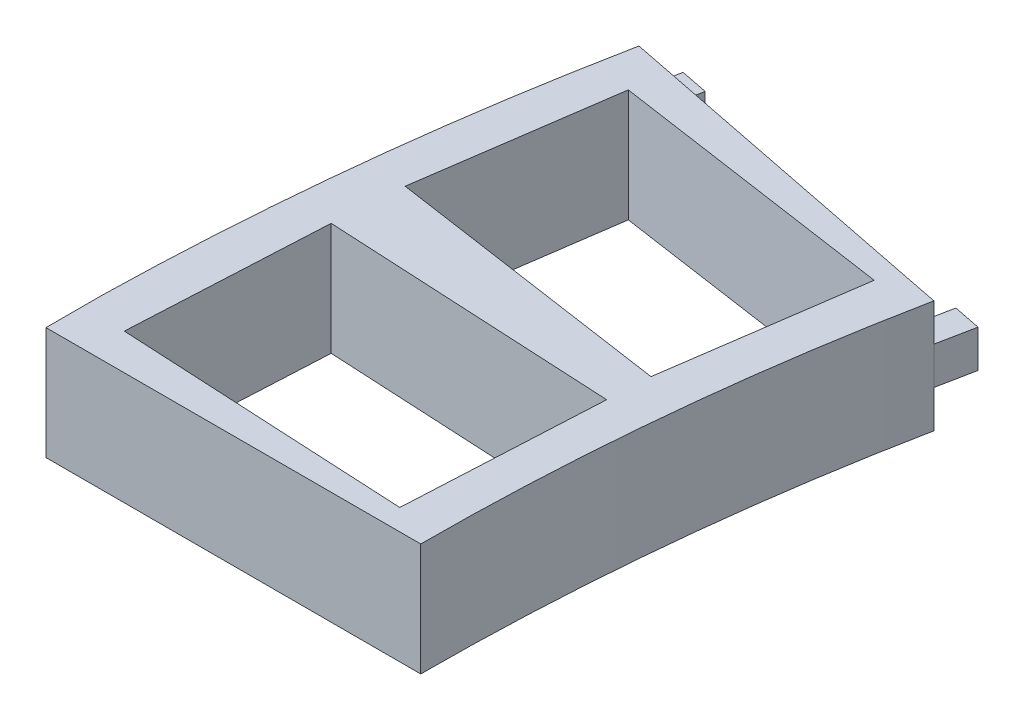
ISO-10303-21;
HEADER;
FILE_DESCRIPTION(('STEP AP214'),'2;1');
FILE_NAME('part.step','',(''),(''),'','','');
FILE_SCHEMA(('AUTOMOTIVE_DESIGN { 1 0 10303 214 1 1 1 1 }'));
ENDSEC;
DATA;
#1=APPLICATION_CONTEXT('core data for automotive mechanical design processes');
#2=APPLICATION_PROTOCOL_DEFINITION('international standard','automotive_design',2000,#1);
#3=PRODUCT_CONTEXT('',#1,'mechanical');
#4=PRODUCT('Part','Part','',(#3));
#5=PRODUCT_RELATED_PRODUCT_CATEGORY('part','',(#4));
#6=PRODUCT_DEFINITION_FORMATION('','',#4);
#7=PRODUCT_DEFINITION_CONTEXT('part definition',#1,'design');
#8=PRODUCT_DEFINITION('design','',#6,#7);
#9=PRODUCT_DEFINITION_SHAPE('','',#8);
#10=(LENGTH_UNIT() NAMED_UNIT(*) SI_UNIT(.MILLI.,.METRE.));
#11=(NAMED_UNIT(*) PLANE_ANGLE_UNIT() SI_UNIT($,.RADIAN.));
#12=(NAMED_UNIT(*) SI_UNIT($,.STERADIAN.) SOLID_ANGLE_UNIT());
#13=UNCERTAINTY_MEASURE_WITH_UNIT(LENGTH_MEASURE(1.E-05),#10,'distance_accuracy_value','');
#14=(GEOMETRIC_REPRESENTATION_CONTEXT(3) GLOBAL_UNCERTAINTY_ASSIGNED_CONTEXT((#13)) GLOBAL_UNIT_ASSIGNED_CONTEXT((#10,
#11,#12)) REPRESENTATION_CONTEXT('',''));
#15=CARTESIAN_POINT('',(0.,0.,0.));
#16=DIRECTION('',(0.,0.,1.));
#17=DIRECTION('',(1.,0.,0.));
#18=AXIS2_PLACEMENT_3D('',#15,#16,#17);
#19=CARTESIAN_POINT('',(0.,12.,0.));
#20=DIRECTION('',(0.,-1.,0.));
#21=DIRECTION('',(0.,0.,-1.));
#22=AXIS2_PLACEMENT_3D('',#19,#20,#21);
#23=CYLINDRICAL_SURFACE('',#22,295.189854561563);
#24=DIRECTION('',(0.,-1.,0.));
#25=VECTOR('',#24,1.);
#26=CARTESIAN_POINT('',(-289.653551964812,12.,-56.9022852813899));
#27=LINE('',#26,#25);
#28=CARTESIAN_POINT('',(-289.653551964812,0.,-56.9022852813899));
#29=VERTEX_POINT('',#28);
#30=CARTESIAN_POINT('',(-289.653551964812,12.,-56.9022852813899));
#31=VERTEX_POINT('',#30);
#32=EDGE_CURVE('E11',#29,#31,#27,.F.);
#33=ORIENTED_EDGE('',*,*,#32,.F.);
#34=CARTESIAN_POINT('',(0.,0.,0.));
#35=DIRECTION('',(0.,1.,0.));
#36=DIRECTION('',(0.,0.,-1.));
#37=AXIS2_PLACEMENT_3D('',#34,#35,#36);
#38=CIRCLE('',#37,295.189854561563);
#39=CARTESIAN_POINT('',(-295.127762341236,0.,-6.0542655650463));
#40=VERTEX_POINT('',#39);
#41=EDGE_CURVE('E339',#29,#40,#38,.T.);
#42=ORIENTED_EDGE('',*,*,#41,.T.);
#43=DIRECTION('',(0.,-1.,0.));
#44=VECTOR('',#43,1.);
#45=CARTESIAN_POINT('',(-295.127762341236,12.,-6.0542655650463));
#46=LINE('',#45,#44);
#47=CARTESIAN_POINT('',(-295.127762341236,12.,-6.0542655650463));
#48=VERTEX_POINT('',#47);
#49=EDGE_CURVE('E375',#48,#40,#46,.T.);
#50=ORIENTED_EDGE('',*,*,#49,.F.);
#51=CARTESIAN_POINT('',(0.,12.,0.));
#52=DIRECTION('',(0.,1.,0.));
#53=DIRECTION('',(0.,0.,-1.));
#54=AXIS2_PLACEMENT_3D('',#51,#52,#53);
#55=CIRCLE('',#54,295.189854561563);
#56=EDGE_CURVE('E51',#31,#48,#55,.T.);
#57=ORIENTED_EDGE('',*,*,#56,.F.);
#58=EDGE_LOOP('',(#33,#42,#50,#57));
#59=FACE_BOUND('',#58,.T.);
#60=ADVANCED_FACE('F37',(#59),#23,.T.);
#61=DIRECTION('',(0.,-1.,0.));
#62=VECTOR('',#61,1.);
#63=CARTESIAN_POINT('',(-289.54025753095,12.,-57.475990682963));
#64=LINE('',#63,#62);
#65=CARTESIAN_POINT('',(-289.54025753095,12.,-57.4759906829631));
#66=VERTEX_POINT('',#65);
#67=CARTESIAN_POINT('',(-289.54025753095,0.,-57.475990682963));
#68=VERTEX_POINT('',#67);
#69=EDGE_CURVE('E58',#66,#68,#64,.T.);
#70=ORIENTED_EDGE('',*,*,#69,.F.);
#71=CARTESIAN_POINT('',(-289.517864278352,12.,-57.5886837823096));
#72=VERTEX_POINT('',#71);
#73=EDGE_CURVE('E340',#72,#66,#55,.T.);
#74=ORIENTED_EDGE('',*,*,#73,.F.);
#75=DIRECTION('',(0.,-1.,0.));
#76=VECTOR('',#75,1.);
#77=CARTESIAN_POINT('',(-289.517864278352,12.,-57.5886837823096));
#78=LINE('',#77,#76);
#79=CARTESIAN_POINT('',(-289.517864278352,0.,-57.5886837823096));
#80=VERTEX_POINT('',#79);
#81=EDGE_CURVE('E350',#72,#80,#78,.T.);
#82=ORIENTED_EDGE('',*,*,#81,.T.);
#83=EDGE_CURVE('E351',#80,#68,#38,.T.);
#84=ORIENTED_EDGE('',*,*,#83,.T.);
#85=EDGE_LOOP('',(#70,#74,#82,#84));
#86=FACE_BOUND('',#85,.T.);
#87=ADVANCED_FACE('F403',(#86),#23,.T.);
#88=CARTESIAN_POINT('',(0.,12.,0.));
#89=DIRECTION('',(0.,-1.,0.));
#90=DIRECTION('',(0.,0.,-1.));
#91=AXIS2_PLACEMENT_3D('',#88,#89,#90);
#92=PLANE('',#91);
#93=DIRECTION('',(-0.98078528040323,0.,-0.195090322016129));
#94=VECTOR('',#93,1.);
#95=CARTESIAN_POINT('',(-289.517864278352,12.,-57.5886837823096));
#96=LINE('',#95,#94);
#97=CARTESIAN_POINT('',(-250.286431131361,12.,-49.785066539345));
#98=VERTEX_POINT('',#97);
#99=EDGE_CURVE('E348',#98,#72,#96,.T.);
#100=ORIENTED_EDGE('',*,*,#99,.T.);
#101=ORIENTED_EDGE('',*,*,#73,.T.);
#102=DIRECTION('',(-0.195090322016147,0.,0.980785280403227));
#103=VECTOR('',#102,1.);
#104=CARTESIAN_POINT('',(-289.654343319705,12.,-56.902442691665));
#105=LINE('',#104,#103);
#106=CARTESIAN_POINT('',(-289.654343319705,12.,-56.902442691665));
#107=VERTEX_POINT('',#106);
#108=EDGE_CURVE('E233',#66,#107,#105,.T.);
#109=ORIENTED_EDGE('',*,*,#108,.T.);
#110=DIRECTION('',(-0.98078528040323,0.,-0.195090322016129));
#111=VECTOR('',#110,1.);
#112=CARTESIAN_POINT('',(-286.711987478495,12.,-56.3171717256166));
#113=LINE('',#112,#111);
#114=EDGE_CURVE('E229',#31,#107,#113,.T.);
#115=ORIENTED_EDGE('',*,*,#114,.F.);
#116=ORIENTED_EDGE('',*,*,#56,.T.);
#117=DIRECTION('',(0.,0.,1.));
#118=VECTOR('',#117,1.);
#119=CARTESIAN_POINT('',(-295.127762341236,12.,-6.0542655650463));
#120=LINE('',#119,#118);
#121=CARTESIAN_POINT('',(-295.127762341235,12.,-3.79080447587832E-12));
#122=VERTEX_POINT('',#121);
#123=EDGE_CURVE('E342',#48,#122,#120,.T.);
#124=ORIENTED_EDGE('',*,*,#123,.T.);
#125=DIRECTION('',(1.,0.,0.));
#126=VECTOR('',#125,1.);
#127=CARTESIAN_POINT('',(-295.127762341235,12.,-3.79080447587832E-12));
#128=LINE('',#127,#126);
#129=CARTESIAN_POINT('',(-255.189832201051,12.,0.));
#130=VERTEX_POINT('',#129);
#131=EDGE_CURVE('E344',#122,#130,#128,.T.);
#132=ORIENTED_EDGE('',*,*,#131,.T.);
#133=CARTESIAN_POINT('',(0.,12.,0.));
#134=DIRECTION('',(0.,-1.,0.));
#135=DIRECTION('',(0.,0.,1.));
#136=AXIS2_PLACEMENT_3D('',#133,#134,#135);
#137=CIRCLE('',#136,255.189832201051);
#138=EDGE_CURVE('E346',#130,#98,#137,.T.);
#139=ORIENTED_EDGE('',*,*,#138,.T.);
#140=EDGE_LOOP('',(#100,#101,#109,#115,#116,#124,#132,#139));
#141=FACE_BOUND('',#140,.T.);
#142=DIRECTION('',(0.998667165886908,0.,0.0516129032259473));
#143=VECTOR('',#142,1.);
#144=CARTESIAN_POINT('',(-259.674858728616,12.,-2.25));
#145=LINE('',#144,#143);
#146=CARTESIAN_POINT('',(-290.633540871111,12.,-3.85000000000439));
#147=VERTEX_POINT('',#146);
#148=CARTESIAN_POINT('',(-259.674858728616,12.,-2.25));
#149=VERTEX_POINT('',#148);
#150=EDGE_CURVE('E278',#147,#149,#145,.T.);
#151=ORIENTED_EDGE('',*,*,#150,.F.);
#152=DIRECTION('',(-0.0513637982567964,0.,0.9986800089261));
#153=VECTOR('',#152,1.);
#154=CARTESIAN_POINT('',(-290.633540871111,12.,-3.85000000000439));
#155=LINE('',#154,#153);
#156=CARTESIAN_POINT('',(-289.554901107718,12.,-24.8222801874558));
#157=VERTEX_POINT('',#156);
#158=EDGE_CURVE('E286',#157,#147,#155,.T.);
#159=ORIENTED_EDGE('',*,*,#158,.F.);
#160=DIRECTION('',(-0.998667165886902,0.,-0.0516129032260692));
#161=VECTOR('',#160,1.);
#162=CARTESIAN_POINT('',(-289.554901107718,12.,-24.8222801874558));
#163=LINE('',#162,#161);
#164=CARTESIAN_POINT('',(-258.596218965224,12.,-23.2222801874477));
#165=VERTEX_POINT('',#164);
#166=EDGE_CURVE('E283',#165,#157,#163,.T.);
#167=ORIENTED_EDGE('',*,*,#166,.F.);
#168=DIRECTION('',(0.0513637982567872,0.,-0.9986800089261));
#169=VECTOR('',#168,1.);
#170=CARTESIAN_POINT('',(-258.596218965224,12.,-23.2222801874477));
#171=LINE('',#170,#169);
#172=EDGE_CURVE('E280',#149,#165,#171,.T.);
#173=ORIENTED_EDGE('',*,*,#172,.F.);
#174=EDGE_LOOP('',(#151,#159,#167,#173));
#175=FACE_BOUND('',#174,.T.);
#176=DIRECTION('',(0.989547234234407,0.,0.144209123217066));
#177=VECTOR('',#176,1.);
#178=CARTESIAN_POINT('',(-258.362561507797,12.,-27.7162098923483));
#179=LINE('',#178,#177);
#180=CARTESIAN_POINT('',(-289.038525769063,12.,-32.1866927120774));
#181=VERTEX_POINT('',#180);
#182=CARTESIAN_POINT('',(-258.362561507797,12.,-27.7162098923483));
#183=VERTEX_POINT('',#182);
#184=EDGE_CURVE('E309',#181,#183,#179,.T.);
#185=ORIENTED_EDGE('',*,*,#184,.F.);
#186=DIRECTION('',(-0.142745540145655,0.,0.989759420651567));
#187=VECTOR('',#186,1.);
#188=CARTESIAN_POINT('',(-289.038525769063,12.,-32.1866927120774));
#189=LINE('',#188,#187);
#190=CARTESIAN_POINT('',(-286.040869426004,12.,-52.9716405457603));
#191=VERTEX_POINT('',#190);
#192=EDGE_CURVE('E317',#191,#181,#189,.T.);
#193=ORIENTED_EDGE('',*,*,#192,.F.);
#194=DIRECTION('',(-0.989547234234407,0.,-0.144209123217066));
#195=VECTOR('',#194,1.);
#196=CARTESIAN_POINT('',(-286.040869426004,12.,-52.9716405457603));
#197=LINE('',#196,#195);
#198=CARTESIAN_POINT('',(-255.364905164738,12.,-48.5011577260312));
#199=VERTEX_POINT('',#198);
#200=EDGE_CURVE('E314',#199,#191,#197,.T.);
#201=ORIENTED_EDGE('',*,*,#200,.F.);
#202=DIRECTION('',(0.142745540145655,0.,-0.989759420651567));
#203=VECTOR('',#202,1.);
#204=CARTESIAN_POINT('',(-255.364905164738,12.,-48.5011577260312));
#205=LINE('',#204,#203);
#206=EDGE_CURVE('E311',#183,#199,#205,.T.);
#207=ORIENTED_EDGE('',*,*,#206,.F.);
#208=EDGE_LOOP('',(#185,#193,#201,#207));
#209=FACE_BOUND('',#208,.T.);
#210=ADVANCED_FACE('F407',(#141,#175,#209),#92,.F.);
#211=CARTESIAN_POINT('',(0.,0.,0.));
#212=DIRECTION('',(0.,-1.,0.));
#213=DIRECTION('',(0.,0.,-1.));
#214=AXIS2_PLACEMENT_3D('',#211,#212,#213);
#215=PLANE('',#214);
#216=ORIENTED_EDGE('',*,*,#41,.F.);
#217=DIRECTION('',(-0.98078528040323,0.,-0.195090322016129));
#218=VECTOR('',#217,1.);
#219=CARTESIAN_POINT('',(-286.711987478495,0.,-56.3171717256166));
#220=LINE('',#219,#218);
#221=CARTESIAN_POINT('',(-289.654343319705,0.,-56.902442691665));
#222=VERTEX_POINT('',#221);
#223=EDGE_CURVE('E240',#29,#222,#220,.T.);
#224=ORIENTED_EDGE('',*,*,#223,.T.);
#225=DIRECTION('',(0.195090322016135,0.,-0.980785280403229));
#226=VECTOR('',#225,1.);
#227=CARTESIAN_POINT('',(-289.517842347491,0.,-57.5886794199901));
#228=LINE('',#227,#226);
#229=EDGE_CURVE('E222',#222,#68,#228,.T.);
#230=ORIENTED_EDGE('',*,*,#229,.T.);
#231=ORIENTED_EDGE('',*,*,#83,.F.);
#232=DIRECTION('',(-0.98078528040323,0.,-0.195090322016129));
#233=VECTOR('',#232,1.);
#234=CARTESIAN_POINT('',(-289.517864278352,0.,-57.5886837823096));
#235=LINE('',#234,#233);
#236=CARTESIAN_POINT('',(-250.286431131361,0.,-49.785066539345));
#237=VERTEX_POINT('',#236);
#238=EDGE_CURVE('E360',#237,#80,#235,.T.);
#239=ORIENTED_EDGE('',*,*,#238,.F.);
#240=CARTESIAN_POINT('',(0.,0.,0.));
#241=DIRECTION('',(0.,-1.,0.));
#242=DIRECTION('',(0.,0.,1.));
#243=AXIS2_PLACEMENT_3D('',#240,#241,#242);
#244=CIRCLE('',#243,255.189832201051);
#245=CARTESIAN_POINT('',(-255.189832201051,0.,0.));
#246=VERTEX_POINT('',#245);
#247=EDGE_CURVE('E357',#246,#237,#244,.T.);
#248=ORIENTED_EDGE('',*,*,#247,.F.);
#249=DIRECTION('',(1.,0.,0.));
#250=VECTOR('',#249,1.);
#251=CARTESIAN_POINT('',(-295.127762341235,0.,-3.79080447587832E-12));
#252=LINE('',#251,#250);
#253=CARTESIAN_POINT('',(-295.127762341235,0.,-3.79080447587832E-12));
#254=VERTEX_POINT('',#253);
#255=EDGE_CURVE('E355',#254,#246,#252,.T.);
#256=ORIENTED_EDGE('',*,*,#255,.F.);
#257=DIRECTION('',(0.,0.,1.));
#258=VECTOR('',#257,1.);
#259=CARTESIAN_POINT('',(-295.127762341236,0.,-6.0542655650463));
#260=LINE('',#259,#258);
#261=EDGE_CURVE('E353',#40,#254,#260,.T.);
#262=ORIENTED_EDGE('',*,*,#261,.F.);
#263=EDGE_LOOP('',(#216,#224,#230,#231,#239,#248,#256,#262));
#264=FACE_BOUND('',#263,.T.);
#265=DIRECTION('',(-0.142745540145655,0.,0.989759420651567));
#266=VECTOR('',#265,1.);
#267=CARTESIAN_POINT('',(-289.038525769063,0.,-32.1866927120774));
#268=LINE('',#267,#266);
#269=CARTESIAN_POINT('',(-286.040869426004,0.,-52.9716405457603));
#270=VERTEX_POINT('',#269);
#271=CARTESIAN_POINT('',(-289.038525769063,0.,-32.1866927120774));
#272=VERTEX_POINT('',#271);
#273=EDGE_CURVE('E312',#270,#272,#268,.T.);
#274=ORIENTED_EDGE('',*,*,#273,.T.);
#275=DIRECTION('',(0.989547234234407,0.,0.144209123217066));
#276=VECTOR('',#275,1.);
#277=CARTESIAN_POINT('',(-258.362561507797,0.,-27.7162098923483));
#278=LINE('',#277,#276);
#279=CARTESIAN_POINT('',(-258.362561507797,0.,-27.7162098923483));
#280=VERTEX_POINT('',#279);
#281=EDGE_CURVE('E308',#272,#280,#278,.T.);
#282=ORIENTED_EDGE('',*,*,#281,.T.);
#283=DIRECTION('',(0.142745540145655,0.,-0.989759420651567));
#284=VECTOR('',#283,1.);
#285=CARTESIAN_POINT('',(-255.364905164738,0.,-48.5011577260312));
#286=LINE('',#285,#284);
#287=CARTESIAN_POINT('',(-255.364905164738,0.,-48.5011577260312));
#288=VERTEX_POINT('',#287);
#289=EDGE_CURVE('E322',#280,#288,#286,.T.);
#290=ORIENTED_EDGE('',*,*,#289,.T.);
#291=DIRECTION('',(-0.989547234234407,0.,-0.144209123217066));
#292=VECTOR('',#291,1.);
#293=CARTESIAN_POINT('',(-286.040869426004,0.,-52.9716405457603));
#294=LINE('',#293,#292);
#295=EDGE_CURVE('E325',#288,#270,#294,.T.);
#296=ORIENTED_EDGE('',*,*,#295,.T.);
#297=EDGE_LOOP('',(#274,#282,#290,#296));
#298=FACE_BOUND('',#297,.T.);
#299=DIRECTION('',(-0.0513637982567964,0.,0.9986800089261));
#300=VECTOR('',#299,1.);
#301=CARTESIAN_POINT('',(-290.633540871111,0.,-3.85000000000439));
#302=LINE('',#301,#300);
#303=CARTESIAN_POINT('',(-289.554901107718,0.,-24.8222801874558));
#304=VERTEX_POINT('',#303);
#305=CARTESIAN_POINT('',(-290.633540871111,0.,-3.8500000000044));
#306=VERTEX_POINT('',#305);
#307=EDGE_CURVE('E281',#304,#306,#302,.T.);
#308=ORIENTED_EDGE('',*,*,#307,.T.);
#309=DIRECTION('',(0.998667165886908,0.,0.0516129032259473));
#310=VECTOR('',#309,1.);
#311=CARTESIAN_POINT('',(-259.674858728616,0.,-2.25));
#312=LINE('',#311,#310);
#313=CARTESIAN_POINT('',(-259.674858728616,0.,-2.25));
#314=VERTEX_POINT('',#313);
#315=EDGE_CURVE('E271',#306,#314,#312,.T.);
#316=ORIENTED_EDGE('',*,*,#315,.T.);
#317=DIRECTION('',(0.0513637982567872,0.,-0.9986800089261));
#318=VECTOR('',#317,1.);
#319=CARTESIAN_POINT('',(-258.596218965224,0.,-23.2222801874477));
#320=LINE('',#319,#318);
#321=CARTESIAN_POINT('',(-258.596218965224,0.,-23.2222801874477));
#322=VERTEX_POINT('',#321);
#323=EDGE_CURVE('E291',#314,#322,#320,.T.);
#324=ORIENTED_EDGE('',*,*,#323,.T.);
#325=DIRECTION('',(-0.998667165886902,0.,-0.0516129032260692));
#326=VECTOR('',#325,1.);
#327=CARTESIAN_POINT('',(-289.554901107718,0.,-24.8222801874558));
#328=LINE('',#327,#326);
#329=EDGE_CURVE('E294',#322,#304,#328,.T.);
#330=ORIENTED_EDGE('',*,*,#329,.T.);
#331=EDGE_LOOP('',(#308,#316,#324,#330));
#332=FACE_BOUND('',#331,.T.);
#333=ADVANCED_FACE('F414',(#264,#298,#332),#215,.T.);
#334=CARTESIAN_POINT('',(-295.127762341236,12.,-6.0542655650463));
#335=DIRECTION('',(1.,0.,0.));
#336=DIRECTION('',(0.,0.,-1.));
#337=AXIS2_PLACEMENT_3D('',#334,#335,#336);
#338=PLANE('',#337);
#339=ORIENTED_EDGE('',*,*,#261,.T.);
#340=DIRECTION('',(0.,-1.,0.));
#341=VECTOR('',#340,1.);
#342=CARTESIAN_POINT('',(-295.127762341235,12.,-3.79080447587832E-12));
#343=LINE('',#342,#341);
#344=EDGE_CURVE('E372',#122,#254,#343,.T.);
#345=ORIENTED_EDGE('',*,*,#344,.F.);
#346=ORIENTED_EDGE('',*,*,#123,.F.);
#347=ORIENTED_EDGE('',*,*,#49,.T.);
#348=EDGE_LOOP('',(#339,#345,#346,#347));
#349=FACE_BOUND('',#348,.T.);
#350=ADVANCED_FACE('F437',(#349),#338,.F.);
#351=CARTESIAN_POINT('',(-295.127762341235,12.,-3.79080447587832E-12));
#352=DIRECTION('',(0.,0.,-1.));
#353=DIRECTION('',(-1.,0.,0.));
#354=AXIS2_PLACEMENT_3D('',#351,#352,#353);
#355=PLANE('',#354);
#356=ORIENTED_EDGE('',*,*,#255,.T.);
#357=DIRECTION('',(0.,-1.,0.));
#358=VECTOR('',#357,1.);
#359=CARTESIAN_POINT('',(-255.189832201051,12.,0.));
#360=LINE('',#359,#358);
#361=EDGE_CURVE('E368',#130,#246,#360,.T.);
#362=ORIENTED_EDGE('',*,*,#361,.F.);
#363=ORIENTED_EDGE('',*,*,#131,.F.);
#364=ORIENTED_EDGE('',*,*,#344,.T.);
#365=EDGE_LOOP('',(#356,#362,#363,#364));
#366=FACE_BOUND('',#365,.T.);
#367=ADVANCED_FACE('F432',(#366),#355,.F.);
#368=CARTESIAN_POINT('',(0.,12.,0.));
#369=DIRECTION('',(0.,-1.,0.));
#370=DIRECTION('',(0.,0.,-1.));
#371=AXIS2_PLACEMENT_3D('',#368,#369,#370);
#372=CYLINDRICAL_SURFACE('',#371,255.189832201051);
#373=ORIENTED_EDGE('',*,*,#247,.T.);
#374=DIRECTION('',(0.,-1.,0.));
#375=VECTOR('',#374,1.);
#376=CARTESIAN_POINT('',(-250.286431131361,12.,-49.785066539345));
#377=LINE('',#376,#375);
#378=CARTESIAN_POINT('',(-250.286431131362,4.,-49.785066539345));
#379=VERTEX_POINT('',#378);
#380=EDGE_CURVE('E364',#379,#237,#377,.T.);
#381=ORIENTED_EDGE('',*,*,#380,.F.);
#382=CARTESIAN_POINT('',(-250.286431131361,8.,-49.785066539345));
#383=VERTEX_POINT('',#382);
#384=EDGE_CURVE('E369',#383,#379,#377,.T.);
#385=ORIENTED_EDGE('',*,*,#384,.F.);
#386=EDGE_CURVE('E365',#98,#383,#377,.T.);
#387=ORIENTED_EDGE('',*,*,#386,.F.);
#388=ORIENTED_EDGE('',*,*,#138,.F.);
#389=ORIENTED_EDGE('',*,*,#361,.T.);
#390=EDGE_LOOP('',(#373,#381,#385,#387,#388,#389));
#391=FACE_BOUND('',#390,.T.);
#392=ADVANCED_FACE('F428',(#391),#372,.F.);
#393=CARTESIAN_POINT('',(-289.517864278352,12.,-57.5886837823096));
#394=DIRECTION('',(-0.195090322016129,0.,0.98078528040323));
#395=DIRECTION('',(0.980785280403231,0.,0.195090322016129));
#396=AXIS2_PLACEMENT_3D('',#393,#394,#395);
#397=PLANE('',#396);
#398=DIRECTION('',(-0.98078528040323,0.,-0.195090322016129));
#399=VECTOR('',#398,1.);
#400=CARTESIAN_POINT('',(-286.575486506281,4.,-57.0034084539418));
#401=LINE('',#400,#399);
#402=CARTESIAN_POINT('',(-286.575486506281,4.,-57.0034084539418));
#403=VERTEX_POINT('',#402);
#404=CARTESIAN_POINT('',(-289.517842347491,4.,-57.5886794199902));
#405=VERTEX_POINT('',#404);
#406=EDGE_CURVE('E242',#403,#405,#401,.T.);
#407=ORIENTED_EDGE('',*,*,#406,.F.);
#408=DIRECTION('',(0.,1.,0.));
#409=VECTOR('',#408,1.);
#410=CARTESIAN_POINT('',(-286.575486506281,12.,-57.0034084539418));
#411=LINE('',#410,#409);
#412=CARTESIAN_POINT('',(-286.575486506281,8.,-57.0034084539418));
#413=VERTEX_POINT('',#412);
#414=EDGE_CURVE('E44',#403,#413,#411,.T.);
#415=ORIENTED_EDGE('',*,*,#414,.T.);
#416=DIRECTION('',(-0.98078528040323,0.,-0.195090322016129));
#417=VECTOR('',#416,1.);
#418=CARTESIAN_POINT('',(-286.575486506281,8.,-57.0034084539417));
#419=LINE('',#418,#417);
#420=CARTESIAN_POINT('',(-289.517842347491,8.,-57.5886794199901));
#421=VERTEX_POINT('',#420);
#422=EDGE_CURVE('E219',#413,#421,#419,.T.);
#423=ORIENTED_EDGE('',*,*,#422,.T.);
#424=DIRECTION('',(0.,1.,0.));
#425=VECTOR('',#424,1.);
#426=CARTESIAN_POINT('',(-289.517842347491,12.,-57.5886794199902));
#427=LINE('',#426,#425);
#428=EDGE_CURVE('E380',#405,#421,#427,.T.);
#429=ORIENTED_EDGE('',*,*,#428,.F.);
#430=EDGE_LOOP('',(#407,#415,#423,#429));
#431=FACE_BOUND('',#430,.T.);
#432=ORIENTED_EDGE('',*,*,#238,.T.);
#433=ORIENTED_EDGE('',*,*,#81,.F.);
#434=ORIENTED_EDGE('',*,*,#99,.F.);
#435=ORIENTED_EDGE('',*,*,#386,.T.);
#436=DIRECTION('',(0.98078528040323,0.,0.195090322016129));
#437=VECTOR('',#436,1.);
#438=CARTESIAN_POINT('',(-253.228786972571,8.,-50.3703375053934));
#439=LINE('',#438,#437);
#440=CARTESIAN_POINT('',(-253.228786972571,8.,-50.3703375053934));
#441=VERTEX_POINT('',#440);
#442=EDGE_CURVE('E268',#441,#383,#439,.T.);
#443=ORIENTED_EDGE('',*,*,#442,.F.);
#444=DIRECTION('',(0.,-1.,0.));
#445=VECTOR('',#444,1.);
#446=CARTESIAN_POINT('',(-253.228786972571,12.,-50.3703375053934));
#447=LINE('',#446,#445);
#448=CARTESIAN_POINT('',(-253.228786972571,4.,-50.3703375053934));
#449=VERTEX_POINT('',#448);
#450=EDGE_CURVE('E378',#441,#449,#447,.T.);
#451=ORIENTED_EDGE('',*,*,#450,.T.);
#452=DIRECTION('',(0.98078528040323,0.,0.195090322016129));
#453=VECTOR('',#452,1.);
#454=CARTESIAN_POINT('',(-253.228786972571,4.,-50.3703375053934));
#455=LINE('',#454,#453);
#456=EDGE_CURVE('E260',#449,#379,#455,.T.);
#457=ORIENTED_EDGE('',*,*,#456,.T.);
#458=ORIENTED_EDGE('',*,*,#380,.T.);
#459=EDGE_LOOP('',(#432,#433,#434,#435,#443,#451,#457,#458));
#460=FACE_BOUND('',#459,.T.);
#461=ADVANCED_FACE('F383',(#431,#460),#397,.F.);
#462=CARTESIAN_POINT('',(-258.362561507797,12.,-27.7162098923483));
#463=DIRECTION('',(0.144209123217066,0.,-0.989547234234407));
#464=DIRECTION('',(-0.989547234234407,0.,-0.144209123217066));
#465=AXIS2_PLACEMENT_3D('',#462,#463,#464);
#466=PLANE('',#465);
#467=ORIENTED_EDGE('',*,*,#281,.F.);
#468=DIRECTION('',(0.,-1.,0.));
#469=VECTOR('',#468,1.);
#470=CARTESIAN_POINT('',(-289.038525769063,12.,-32.1866927120774));
#471=LINE('',#470,#469);
#472=EDGE_CURVE('E319',#181,#272,#471,.T.);
#473=ORIENTED_EDGE('',*,*,#472,.F.);
#474=ORIENTED_EDGE('',*,*,#184,.T.);
#475=DIRECTION('',(0.,-1.,0.));
#476=VECTOR('',#475,1.);
#477=CARTESIAN_POINT('',(-258.362561507797,12.,-27.7162098923483));
#478=LINE('',#477,#476);
#479=EDGE_CURVE('E336',#183,#280,#478,.T.);
#480=ORIENTED_EDGE('',*,*,#479,.T.);
#481=EDGE_LOOP('',(#467,#473,#474,#480));
#482=FACE_BOUND('',#481,.T.);
#483=ADVANCED_FACE('F495',(#482),#466,.T.);
#484=CARTESIAN_POINT('',(-255.364905164738,12.,-48.5011577260312));
#485=DIRECTION('',(-0.989759420651567,0.,-0.142745540145655));
#486=DIRECTION('',(-0.142745540145655,0.,0.989759420651567));
#487=AXIS2_PLACEMENT_3D('',#484,#485,#486);
#488=PLANE('',#487);
#489=ORIENTED_EDGE('',*,*,#289,.F.);
#490=ORIENTED_EDGE('',*,*,#479,.F.);
#491=ORIENTED_EDGE('',*,*,#206,.T.);
#492=DIRECTION('',(0.,-1.,0.));
#493=VECTOR('',#492,1.);
#494=CARTESIAN_POINT('',(-255.364905164738,12.,-48.5011577260312));
#495=LINE('',#494,#493);
#496=EDGE_CURVE('E334',#199,#288,#495,.T.);
#497=ORIENTED_EDGE('',*,*,#496,.T.);
#498=EDGE_LOOP('',(#489,#490,#491,#497));
#499=FACE_BOUND('',#498,.T.);
#500=ADVANCED_FACE('F491',(#499),#488,.T.);
#501=CARTESIAN_POINT('',(-286.040869426004,12.,-52.9716405457603));
#502=DIRECTION('',(-0.144209123217066,0.,0.989547234234407));
#503=DIRECTION('',(0.989547234234407,0.,0.144209123217066));
#504=AXIS2_PLACEMENT_3D('',#501,#502,#503);
#505=PLANE('',#504);
#506=ORIENTED_EDGE('',*,*,#295,.F.);
#507=ORIENTED_EDGE('',*,*,#496,.F.);
#508=ORIENTED_EDGE('',*,*,#200,.T.);
#509=DIRECTION('',(0.,-1.,0.));
#510=VECTOR('',#509,1.);
#511=CARTESIAN_POINT('',(-286.040869426004,12.,-52.9716405457603));
#512=LINE('',#511,#510);
#513=EDGE_CURVE('E332',#191,#270,#512,.T.);
#514=ORIENTED_EDGE('',*,*,#513,.T.);
#515=EDGE_LOOP('',(#506,#507,#508,#514));
#516=FACE_BOUND('',#515,.T.);
#517=ADVANCED_FACE('F487',(#516),#505,.T.);
#518=CARTESIAN_POINT('',(-289.038525769063,12.,-32.1866927120774));
#519=DIRECTION('',(0.989759420651567,0.,0.142745540145655));
#520=DIRECTION('',(0.142745540145655,0.,-0.989759420651567));
#521=AXIS2_PLACEMENT_3D('',#518,#519,#520);
#522=PLANE('',#521);
#523=ORIENTED_EDGE('',*,*,#273,.F.);
#524=ORIENTED_EDGE('',*,*,#513,.F.);
#525=ORIENTED_EDGE('',*,*,#192,.T.);
#526=ORIENTED_EDGE('',*,*,#472,.T.);
#527=EDGE_LOOP('',(#523,#524,#525,#526));
#528=FACE_BOUND('',#527,.T.);
#529=ADVANCED_FACE('F483',(#528),#522,.T.);
#530=CARTESIAN_POINT('',(-259.674858728616,12.,-2.25));
#531=DIRECTION('',(0.0516129032259473,0.,-0.998667165886908));
#532=DIRECTION('',(-0.998667165886908,0.,-0.0516129032259474));
#533=AXIS2_PLACEMENT_3D('',#530,#531,#532);
#534=PLANE('',#533);
#535=ORIENTED_EDGE('',*,*,#315,.F.);
#536=DIRECTION('',(0.,-1.,0.));
#537=VECTOR('',#536,1.);
#538=CARTESIAN_POINT('',(-290.633540871111,12.,-3.85000000000439));
#539=LINE('',#538,#537);
#540=EDGE_CURVE('E288',#147,#306,#539,.T.);
#541=ORIENTED_EDGE('',*,*,#540,.F.);
#542=ORIENTED_EDGE('',*,*,#150,.T.);
#543=DIRECTION('',(0.,-1.,0.));
#544=VECTOR('',#543,1.);
#545=CARTESIAN_POINT('',(-259.674858728616,12.,-2.25));
#546=LINE('',#545,#544);
#547=EDGE_CURVE('E305',#149,#314,#546,.T.);
#548=ORIENTED_EDGE('',*,*,#547,.T.);
#549=EDGE_LOOP('',(#535,#541,#542,#548));
#550=FACE_BOUND('',#549,.T.);
#551=ADVANCED_FACE('F479',(#550),#534,.T.);
#552=CARTESIAN_POINT('',(-258.596218965224,12.,-23.2222801874477));
#553=DIRECTION('',(-0.9986800089261,0.,-0.0513637982567872));
#554=DIRECTION('',(-0.0513637982567872,0.,0.998680008926101));
#555=AXIS2_PLACEMENT_3D('',#552,#553,#554);
#556=PLANE('',#555);
#557=ORIENTED_EDGE('',*,*,#323,.F.);
#558=ORIENTED_EDGE('',*,*,#547,.F.);
#559=ORIENTED_EDGE('',*,*,#172,.T.);
#560=DIRECTION('',(0.,-1.,0.));
#561=VECTOR('',#560,1.);
#562=CARTESIAN_POINT('',(-258.596218965224,12.,-23.2222801874477));
#563=LINE('',#562,#561);
#564=EDGE_CURVE('E303',#165,#322,#563,.T.);
#565=ORIENTED_EDGE('',*,*,#564,.T.);
#566=EDGE_LOOP('',(#557,#558,#559,#565));
#567=FACE_BOUND('',#566,.T.);
#568=ADVANCED_FACE('F475',(#567),#556,.T.);
#569=CARTESIAN_POINT('',(-289.554901107718,12.,-24.8222801874558));
#570=DIRECTION('',(-0.0516129032260692,0.,0.998667165886902));
#571=DIRECTION('',(0.998667165886902,0.,0.0516129032260692));
#572=AXIS2_PLACEMENT_3D('',#569,#570,#571);
#573=PLANE('',#572);
#574=ORIENTED_EDGE('',*,*,#329,.F.);
#575=ORIENTED_EDGE('',*,*,#564,.F.);
#576=ORIENTED_EDGE('',*,*,#166,.T.);
#577=DIRECTION('',(0.,-1.,0.));
#578=VECTOR('',#577,1.);
#579=CARTESIAN_POINT('',(-289.554901107718,12.,-24.8222801874558));
#580=LINE('',#579,#578);
#581=EDGE_CURVE('E301',#157,#304,#580,.T.);
#582=ORIENTED_EDGE('',*,*,#581,.T.);
#583=EDGE_LOOP('',(#574,#575,#576,#582));
#584=FACE_BOUND('',#583,.T.);
#585=ADVANCED_FACE('F471',(#584),#573,.T.);
#586=CARTESIAN_POINT('',(-290.633540871111,12.,-3.85000000000439));
#587=DIRECTION('',(0.9986800089261,0.,0.0513637982567964));
#588=DIRECTION('',(0.0513637982567964,0.,-0.9986800089261));
#589=AXIS2_PLACEMENT_3D('',#586,#587,#588);
#590=PLANE('',#589);
#591=ORIENTED_EDGE('',*,*,#307,.F.);
#592=ORIENTED_EDGE('',*,*,#581,.F.);
#593=ORIENTED_EDGE('',*,*,#158,.T.);
#594=ORIENTED_EDGE('',*,*,#540,.T.);
#595=EDGE_LOOP('',(#591,#592,#593,#594));
#596=FACE_BOUND('',#595,.T.);
#597=ADVANCED_FACE('F468',(#596),#590,.T.);
#598=CARTESIAN_POINT('',(-253.228786972572,0.,-50.3703375053888));
#599=DIRECTION('',(-0.980785280403234,0.,-0.195090322016111));
#600=DIRECTION('',(-0.195090322016111,0.,0.980785280403234));
#601=AXIS2_PLACEMENT_3D('',#598,#599,#600);
#602=PLANE('',#601);
#603=ORIENTED_EDGE('',*,*,#450,.F.);
#604=DIRECTION('',(-0.195090322016129,0.,0.98078528040323));
#605=VECTOR('',#604,1.);
#606=CARTESIAN_POINT('',(-253.228786972571,8.,-50.3703375053934));
#607=LINE('',#606,#605);
#608=CARTESIAN_POINT('',(-252.448425684507,8.,-54.2934786270063));
#609=VERTEX_POINT('',#608);
#610=EDGE_CURVE('E257',#609,#441,#607,.T.);
#611=ORIENTED_EDGE('',*,*,#610,.F.);
#612=DIRECTION('',(0.,1.,0.));
#613=VECTOR('',#612,1.);
#614=CARTESIAN_POINT('',(-252.448425684507,8.,-54.2934786270063));
#615=LINE('',#614,#613);
#616=CARTESIAN_POINT('',(-252.448425684507,4.,-54.2934786270063));
#617=VERTEX_POINT('',#616);
#618=EDGE_CURVE('E253',#617,#609,#615,.T.);
#619=ORIENTED_EDGE('',*,*,#618,.F.);
#620=DIRECTION('',(0.195090322016131,0.,-0.98078528040323));
#621=VECTOR('',#620,1.);
#622=CARTESIAN_POINT('',(-252.448425684507,4.,-54.2934786270063));
#623=LINE('',#622,#621);
#624=EDGE_CURVE('E250',#449,#617,#623,.T.);
#625=ORIENTED_EDGE('',*,*,#624,.F.);
#626=EDGE_LOOP('',(#603,#611,#619,#625));
#627=FACE_BOUND('',#626,.T.);
#628=ADVANCED_FACE('F454',(#627),#602,.T.);
#629=CARTESIAN_POINT('',(-250.286431131363,0.,-49.7850665393404));
#630=DIRECTION('',(-0.980785280403234,0.,-0.195090322016111));
#631=DIRECTION('',(-0.195090322016111,0.,0.980785280403234));
#632=AXIS2_PLACEMENT_3D('',#629,#630,#631);
#633=PLANE('',#632);
#634=DIRECTION('',(-0.195090322016129,0.,0.98078528040323));
#635=VECTOR('',#634,1.);
#636=CARTESIAN_POINT('',(-250.286431131362,8.,-49.785066539345));
#637=LINE('',#636,#635);
#638=CARTESIAN_POINT('',(-249.506069843297,8.,-53.7082076609579));
#639=VERTEX_POINT('',#638);
#640=EDGE_CURVE('E254',#639,#383,#637,.T.);
#641=ORIENTED_EDGE('',*,*,#640,.T.);
#642=ORIENTED_EDGE('',*,*,#384,.T.);
#643=DIRECTION('',(0.195090322016131,0.,-0.98078528040323));
#644=VECTOR('',#643,1.);
#645=CARTESIAN_POINT('',(-249.506069843297,4.,-53.7082076609579));
#646=LINE('',#645,#644);
#647=CARTESIAN_POINT('',(-249.506069843297,4.,-53.7082076609579));
#648=VERTEX_POINT('',#647);
#649=EDGE_CURVE('E249',#379,#648,#646,.T.);
#650=ORIENTED_EDGE('',*,*,#649,.T.);
#651=DIRECTION('',(0.,1.,0.));
#652=VECTOR('',#651,1.);
#653=CARTESIAN_POINT('',(-249.506069843297,8.,-53.7082076609579));
#654=LINE('',#653,#652);
#655=EDGE_CURVE('E263',#648,#639,#654,.T.);
#656=ORIENTED_EDGE('',*,*,#655,.T.);
#657=EDGE_LOOP('',(#641,#642,#650,#656));
#658=FACE_BOUND('',#657,.T.);
#659=ADVANCED_FACE('F447',(#658),#633,.F.);
#660=CARTESIAN_POINT('',(-253.228786972571,8.,-50.3703375053934));
#661=DIRECTION('',(0.,1.,0.));
#662=DIRECTION('',(0.,0.,1.));
#663=AXIS2_PLACEMENT_3D('',#660,#661,#662);
#664=PLANE('',#663);
#665=ORIENTED_EDGE('',*,*,#640,.F.);
#666=DIRECTION('',(0.98078528040323,0.,0.195090322016129));
#667=VECTOR('',#666,1.);
#668=CARTESIAN_POINT('',(-252.448425684507,8.,-54.2934786270063));
#669=LINE('',#668,#667);
#670=EDGE_CURVE('E272',#609,#639,#669,.T.);
#671=ORIENTED_EDGE('',*,*,#670,.F.);
#672=ORIENTED_EDGE('',*,*,#610,.T.);
#673=ORIENTED_EDGE('',*,*,#442,.T.);
#674=EDGE_LOOP('',(#665,#671,#672,#673));
#675=FACE_BOUND('',#674,.T.);
#676=ADVANCED_FACE('F444',(#675),#664,.T.);
#677=CARTESIAN_POINT('',(-252.448425684507,8.,-54.2934786270063));
#678=DIRECTION('',(0.195090322016129,0.,-0.98078528040323));
#679=DIRECTION('',(-0.98078528040323,0.,-0.195090322016129));
#680=AXIS2_PLACEMENT_3D('',#677,#678,#679);
#681=PLANE('',#680);
#682=ORIENTED_EDGE('',*,*,#655,.F.);
#683=DIRECTION('',(0.98078528040323,0.,0.195090322016129));
#684=VECTOR('',#683,1.);
#685=CARTESIAN_POINT('',(-252.448425684507,4.,-54.2934786270063));
#686=LINE('',#685,#684);
#687=EDGE_CURVE('E274',#617,#648,#686,.T.);
#688=ORIENTED_EDGE('',*,*,#687,.F.);
#689=ORIENTED_EDGE('',*,*,#618,.T.);
#690=ORIENTED_EDGE('',*,*,#670,.T.);
#691=EDGE_LOOP('',(#682,#688,#689,#690));
#692=FACE_BOUND('',#691,.T.);
#693=ADVANCED_FACE('F451',(#692),#681,.T.);
#694=CARTESIAN_POINT('',(-252.448425684507,4.,-54.2934786270063));
#695=DIRECTION('',(0.,-1.,0.));
#696=DIRECTION('',(0.,0.,-1.));
#697=AXIS2_PLACEMENT_3D('',#694,#695,#696);
#698=PLANE('',#697);
#699=ORIENTED_EDGE('',*,*,#649,.F.);
#700=ORIENTED_EDGE('',*,*,#456,.F.);
#701=ORIENTED_EDGE('',*,*,#624,.T.);
#702=ORIENTED_EDGE('',*,*,#687,.T.);
#703=EDGE_LOOP('',(#699,#700,#701,#702));
#704=FACE_BOUND('',#703,.T.);
#705=ADVANCED_FACE('F457',(#704),#698,.T.);
#706=CARTESIAN_POINT('',(-286.575486506281,8.,-57.0034084539417));
#707=DIRECTION('',(0.,-1.,0.));
#708=DIRECTION('',(0.,0.,-1.));
#709=AXIS2_PLACEMENT_3D('',#706,#707,#708);
#710=PLANE('',#709);
#711=DIRECTION('',(-0.195090322016128,0.,0.98078528040323));
#712=VECTOR('',#711,1.);
#713=CARTESIAN_POINT('',(-289.517842347491,8.,-57.5886794199901));
#714=LINE('',#713,#712);
#715=CARTESIAN_POINT('',(-288.737481059426,8.,-61.5118205416031));
#716=VERTEX_POINT('',#715);
#717=EDGE_CURVE('E236',#716,#421,#714,.T.);
#718=ORIENTED_EDGE('',*,*,#717,.T.);
#719=ORIENTED_EDGE('',*,*,#422,.F.);
#720=DIRECTION('',(-0.195090322016128,0.,0.98078528040323));
#721=VECTOR('',#720,1.);
#722=CARTESIAN_POINT('',(-286.575486506281,8.,-57.0034084539417));
#723=LINE('',#722,#721);
#724=CARTESIAN_POINT('',(-285.795125218217,8.,-60.9265495755547));
#725=VERTEX_POINT('',#724);
#726=EDGE_CURVE('E202',#725,#413,#723,.T.);
#727=ORIENTED_EDGE('',*,*,#726,.F.);
#728=DIRECTION('',(-0.98078528040323,0.,-0.195090322016129));
#729=VECTOR('',#728,1.);
#730=CARTESIAN_POINT('',(-285.795125218217,8.,-60.9265495755547));
#731=LINE('',#730,#729);
#732=EDGE_CURVE('E211',#725,#716,#731,.T.);
#733=ORIENTED_EDGE('',*,*,#732,.T.);
#734=EDGE_LOOP('',(#718,#719,#727,#733));
#735=FACE_BOUND('',#734,.T.);
#736=ADVANCED_FACE('F221',(#735),#710,.F.);
#737=CARTESIAN_POINT('',(-285.795125218217,8.,-60.9265495755547));
#738=DIRECTION('',(-0.195090322016129,0.,0.98078528040323));
#739=DIRECTION('',(0.98078528040323,0.,0.195090322016129));
#740=AXIS2_PLACEMENT_3D('',#737,#738,#739);
#741=PLANE('',#740);
#742=DIRECTION('',(0.,1.,0.));
#743=VECTOR('',#742,1.);
#744=CARTESIAN_POINT('',(-288.737481059426,8.,-61.5118205416031));
#745=LINE('',#744,#743);
#746=CARTESIAN_POINT('',(-288.737481059426,4.,-61.5118205416031));
#747=VERTEX_POINT('',#746);
#748=EDGE_CURVE('E214',#747,#716,#745,.T.);
#749=ORIENTED_EDGE('',*,*,#748,.T.);
#750=ORIENTED_EDGE('',*,*,#732,.F.);
#751=DIRECTION('',(0.,1.,0.));
#752=VECTOR('',#751,1.);
#753=CARTESIAN_POINT('',(-285.795125218217,8.,-60.9265495755547));
#754=LINE('',#753,#752);
#755=CARTESIAN_POINT('',(-285.795125218217,4.,-60.9265495755547));
#756=VERTEX_POINT('',#755);
#757=EDGE_CURVE('E197',#756,#725,#754,.T.);
#758=ORIENTED_EDGE('',*,*,#757,.F.);
#759=DIRECTION('',(-0.98078528040323,0.,-0.195090322016129));
#760=VECTOR('',#759,1.);
#761=CARTESIAN_POINT('',(-285.795125218217,4.,-60.9265495755547));
#762=LINE('',#761,#760);
#763=EDGE_CURVE('E218',#756,#747,#762,.T.);
#764=ORIENTED_EDGE('',*,*,#763,.T.);
#765=EDGE_LOOP('',(#749,#750,#758,#764));
#766=FACE_BOUND('',#765,.T.);
#767=ADVANCED_FACE('F212',(#766),#741,.F.);
#768=CARTESIAN_POINT('',(-285.795125218217,4.,-60.9265495755547));
#769=DIRECTION('',(0.,1.,0.));
#770=DIRECTION('',(0.,0.,1.));
#771=AXIS2_PLACEMENT_3D('',#768,#769,#770);
#772=PLANE('',#771);
#773=DIRECTION('',(0.195090322016126,0.,-0.980785280403231));
#774=VECTOR('',#773,1.);
#775=CARTESIAN_POINT('',(-288.737481059426,4.,-61.5118205416031));
#776=LINE('',#775,#774);
#777=EDGE_CURVE('E225',#405,#747,#776,.T.);
#778=ORIENTED_EDGE('',*,*,#777,.T.);
#779=ORIENTED_EDGE('',*,*,#763,.F.);
#780=DIRECTION('',(0.195090322016126,0.,-0.980785280403231));
#781=VECTOR('',#780,1.);
#782=CARTESIAN_POINT('',(-285.795125218217,4.,-60.9265495755547));
#783=LINE('',#782,#781);
#784=EDGE_CURVE('E205',#403,#756,#783,.T.);
#785=ORIENTED_EDGE('',*,*,#784,.F.);
#786=ORIENTED_EDGE('',*,*,#406,.T.);
#787=EDGE_LOOP('',(#778,#779,#785,#786));
#788=FACE_BOUND('',#787,.T.);
#789=ADVANCED_FACE('F386',(#788),#772,.F.);
#790=CARTESIAN_POINT('',(-289.517842347492,0.,-57.5886794199855));
#791=DIRECTION('',(0.980785280403227,0.,0.195090322016147));
#792=DIRECTION('',(-0.195090322016147,0.,0.980785280403227));
#793=AXIS2_PLACEMENT_3D('',#790,#791,#792);
#794=PLANE('',#793);
#795=ORIENTED_EDGE('',*,*,#777,.F.);
#796=ORIENTED_EDGE('',*,*,#428,.T.);
#797=ORIENTED_EDGE('',*,*,#717,.F.);
#798=ORIENTED_EDGE('',*,*,#748,.F.);
#799=EDGE_LOOP('',(#795,#796,#797,#798));
#800=FACE_BOUND('',#799,.T.);
#801=ADVANCED_FACE('F389',(#800),#794,.F.);
#802=CARTESIAN_POINT('',(-286.575486506282,0.,-57.0034084539371));
#803=DIRECTION('',(0.980785280403227,0.,0.195090322016147));
#804=DIRECTION('',(-0.195090322016147,0.,0.980785280403227));
#805=AXIS2_PLACEMENT_3D('',#802,#803,#804);
#806=PLANE('',#805);
#807=ORIENTED_EDGE('',*,*,#414,.F.);
#808=ORIENTED_EDGE('',*,*,#784,.T.);
#809=ORIENTED_EDGE('',*,*,#757,.T.);
#810=ORIENTED_EDGE('',*,*,#726,.T.);
#811=EDGE_LOOP('',(#807,#808,#809,#810));
#812=FACE_BOUND('',#811,.T.);
#813=ADVANCED_FACE('F200',(#812),#806,.T.);
#814=CARTESIAN_POINT('',(-286.711987478495,0.,-56.3171717256166));
#815=DIRECTION('',(0.195090322016129,0.,-0.98078528040323));
#816=DIRECTION('',(-0.98078528040323,0.,-0.195090322016129));
#817=AXIS2_PLACEMENT_3D('',#814,#815,#816);
#818=PLANE('',#817);
#819=ORIENTED_EDGE('',*,*,#223,.F.);
#820=ORIENTED_EDGE('',*,*,#32,.T.);
#821=ORIENTED_EDGE('',*,*,#114,.T.);
#822=DIRECTION('',(0.,-1.,0.));
#823=VECTOR('',#822,1.);
#824=CARTESIAN_POINT('',(-289.654343319705,0.,-56.902442691665));
#825=LINE('',#824,#823);
#826=EDGE_CURVE('E230',#107,#222,#825,.T.);
#827=ORIENTED_EDGE('',*,*,#826,.T.);
#828=EDGE_LOOP('',(#819,#820,#821,#827));
#829=FACE_BOUND('',#828,.T.);
#830=ADVANCED_FACE('F397',(#829),#818,.F.);
#831=ORIENTED_EDGE('',*,*,#108,.F.);
#832=ORIENTED_EDGE('',*,*,#69,.T.);
#833=ORIENTED_EDGE('',*,*,#229,.F.);
#834=ORIENTED_EDGE('',*,*,#826,.F.);
#835=EDGE_LOOP('',(#831,#832,#833,#834));
#836=FACE_BOUND('',#835,.T.);
#837=ADVANCED_FACE('F392',(#836),#794,.F.);
#838=CLOSED_SHELL('',(#60,#87,#210,#333,#350,#367,#392,#461,#483,#500,#517,#529,#551,#568,#585,
#597,#628,#659,#676,#693,#705,#736,#767,#789,#801,#813,#830,#837));
#839=MANIFOLD_SOLID_BREP('B2',#838);
#840=ADVANCED_BREP_SHAPE_REPRESENTATION('',(#18,#839),#14);
#841=SHAPE_DEFINITION_REPRESENTATION(#9,#840);
ENDSEC;
END-ISO-10303-21;
